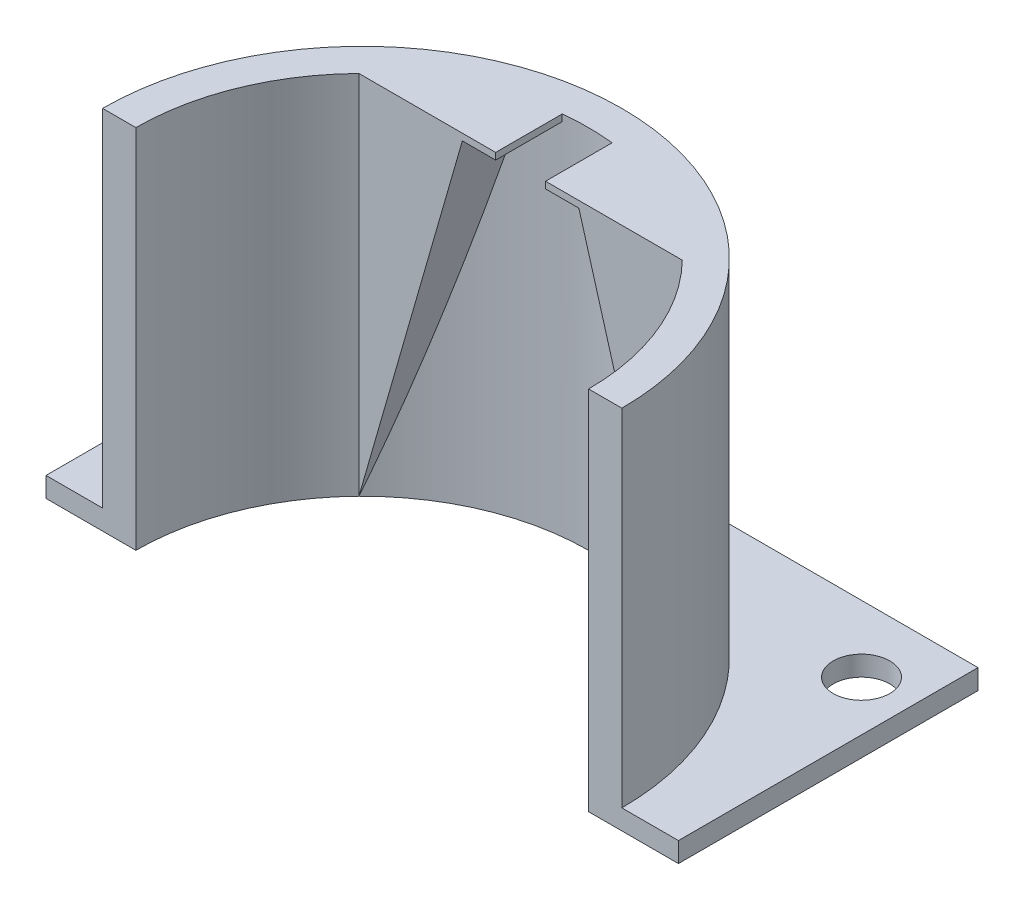
ISO-10303-21;
HEADER;
FILE_DESCRIPTION(('STEP AP214'),'2;1');
FILE_NAME('part.step','',(''),(''),'','','');
FILE_SCHEMA(('AUTOMOTIVE_DESIGN { 1 0 10303 214 1 1 1 1 }'));
ENDSEC;
DATA;
#1=APPLICATION_CONTEXT('core data for automotive mechanical design processes');
#2=APPLICATION_PROTOCOL_DEFINITION('international standard','automotive_design',2000,#1);
#3=PRODUCT_CONTEXT('',#1,'mechanical');
#4=PRODUCT('Part','Part','',(#3));
#5=PRODUCT_RELATED_PRODUCT_CATEGORY('part','',(#4));
#6=PRODUCT_DEFINITION_FORMATION('','',#4);
#7=PRODUCT_DEFINITION_CONTEXT('part definition',#1,'design');
#8=PRODUCT_DEFINITION('design','',#6,#7);
#9=PRODUCT_DEFINITION_SHAPE('','',#8);
#10=(LENGTH_UNIT() NAMED_UNIT(*) SI_UNIT(.MILLI.,.METRE.));
#11=(NAMED_UNIT(*) PLANE_ANGLE_UNIT() SI_UNIT($,.RADIAN.));
#12=(NAMED_UNIT(*) SI_UNIT($,.STERADIAN.) SOLID_ANGLE_UNIT());
#13=UNCERTAINTY_MEASURE_WITH_UNIT(LENGTH_MEASURE(1.E-05),#10,'distance_accuracy_value','');
#14=(GEOMETRIC_REPRESENTATION_CONTEXT(3) GLOBAL_UNCERTAINTY_ASSIGNED_CONTEXT((#13)) GLOBAL_UNIT_ASSIGNED_CONTEXT((#10,
#11,#12)) REPRESENTATION_CONTEXT('',''));
#15=CARTESIAN_POINT('',(0.,0.,0.));
#16=DIRECTION('',(0.,0.,1.));
#17=DIRECTION('',(1.,0.,0.));
#18=AXIS2_PLACEMENT_3D('',#15,#16,#17);
#19=CARTESIAN_POINT('',(0.,55.,45.));
#20=DIRECTION('',(0.,-1.,0.));
#21=DIRECTION('',(0.,0.,-1.));
#22=AXIS2_PLACEMENT_3D('',#19,#20,#21);
#23=CYLINDRICAL_SURFACE('',#22,34.);
#24=CARTESIAN_POINT('',(0.,55.,45.));
#25=DIRECTION('',(0.,-1.,0.));
#26=DIRECTION('',(0.,0.,1.));
#27=AXIS2_PLACEMENT_3D('',#24,#25,#26);
#28=CIRCLE('',#27,34.);
#29=CARTESIAN_POINT('',(24.2881414482345,55.,21.2074342495276));
#30=VERTEX_POINT('',#29);
#31=CARTESIAN_POINT('',(34.,55.,45.));
#32=VERTEX_POINT('',#31);
#33=EDGE_CURVE('E67',#30,#32,#28,.T.);
#34=ORIENTED_EDGE('',*,*,#33,.F.);
#35=DIRECTION('',(0.,1.,0.));
#36=VECTOR('',#35,1.);
#37=CARTESIAN_POINT('',(24.2881414482345,0.,21.2074342495276));
#38=LINE('',#37,#36);
#39=CARTESIAN_POINT('',(24.2881414482345,0.,21.2074342495276));
#40=VERTEX_POINT('',#39);
#41=EDGE_CURVE('E330',#40,#30,#38,.T.);
#42=ORIENTED_EDGE('',*,*,#41,.F.);
#43=CARTESIAN_POINT('',(0.,0.,45.));
#44=DIRECTION('',(0.,-1.,0.));
#45=DIRECTION('',(0.,0.,1.));
#46=AXIS2_PLACEMENT_3D('',#43,#44,#45);
#47=CIRCLE('',#46,34.);
#48=CARTESIAN_POINT('',(34.,0.,45.));
#49=VERTEX_POINT('',#48);
#50=EDGE_CURVE('E165',#40,#49,#47,.T.);
#51=ORIENTED_EDGE('',*,*,#50,.T.);
#52=DIRECTION('',(0.,-1.,0.));
#53=VECTOR('',#52,1.);
#54=CARTESIAN_POINT('',(34.,55.,45.));
#55=LINE('',#54,#53);
#56=EDGE_CURVE('E295',#32,#49,#55,.T.);
#57=ORIENTED_EDGE('',*,*,#56,.F.);
#58=EDGE_LOOP('',(#34,#42,#51,#57));
#59=FACE_BOUND('',#58,.T.);
#60=ADVANCED_FACE('F43',(#59),#23,.F.);
#61=CARTESIAN_POINT('',(-24.2881414482345,0.,21.2074342495276));
#62=VERTEX_POINT('',#61);
#63=EDGE_CURVE('E158',#62,#40,#47,.T.);
#64=ORIENTED_EDGE('',*,*,#63,.T.);
#65=CARTESIAN_POINT('',(0.,84.409042263783,45.));
#66=DIRECTION('',(0.961007175111743,0.276523433697306,0.));
#67=DIRECTION('',(0.276523433697306,-0.961007175111743,0.));
#68=AXIS2_PLACEMENT_3D('',#65,#66,#67);
#69=ELLIPSE('',#68,122.955221354649,34.);
#70=CARTESIAN_POINT('',(8.75000000000001,54.,12.1452058292857));
#71=VERTEX_POINT('',#70);
#72=EDGE_CURVE('E183',#40,#71,#69,.T.);
#73=ORIENTED_EDGE('',*,*,#72,.T.);
#74=CARTESIAN_POINT('',(0.,54.,45.));
#75=DIRECTION('',(0.,1.,0.));
#76=DIRECTION('',(0.,0.,1.));
#77=AXIS2_PLACEMENT_3D('',#74,#75,#76);
#78=CIRCLE('',#77,34.);
#79=CARTESIAN_POINT('',(3.75000000000001,54.,11.2074342495276));
#80=VERTEX_POINT('',#79);
#81=EDGE_CURVE('E364',#71,#80,#78,.T.);
#82=ORIENTED_EDGE('',*,*,#81,.T.);
#83=DIRECTION('',(0.,1.,0.));
#84=VECTOR('',#83,1.);
#85=CARTESIAN_POINT('',(3.74999999999999,0.,11.2074342495276));
#86=LINE('',#85,#84);
#87=CARTESIAN_POINT('',(3.74999999999999,55.,11.2074342495276));
#88=VERTEX_POINT('',#87);
#89=EDGE_CURVE('E340',#80,#88,#86,.T.);
#90=ORIENTED_EDGE('',*,*,#89,.T.);
#91=CARTESIAN_POINT('',(-3.75000000000001,55.,11.2074342495276));
#92=VERTEX_POINT('',#91);
#93=EDGE_CURVE('E271',#92,#88,#28,.T.);
#94=ORIENTED_EDGE('',*,*,#93,.F.);
#95=DIRECTION('',(0.,1.,0.));
#96=VECTOR('',#95,1.);
#97=CARTESIAN_POINT('',(-3.75000000000001,0.,11.2074342495276));
#98=LINE('',#97,#96);
#99=CARTESIAN_POINT('',(-3.75000000000001,54.,11.2074342495276));
#100=VERTEX_POINT('',#99);
#101=EDGE_CURVE('E211',#100,#92,#98,.T.);
#102=ORIENTED_EDGE('',*,*,#101,.F.);
#103=CARTESIAN_POINT('',(0.,54.,45.));
#104=DIRECTION('',(0.,1.,0.));
#105=DIRECTION('',(0.,0.,1.));
#106=AXIS2_PLACEMENT_3D('',#103,#104,#105);
#107=CIRCLE('',#106,34.);
#108=CARTESIAN_POINT('',(-8.75000000000001,54.,12.1452058292857));
#109=VERTEX_POINT('',#108);
#110=EDGE_CURVE('E188',#100,#109,#107,.T.);
#111=ORIENTED_EDGE('',*,*,#110,.T.);
#112=CARTESIAN_POINT('',(0.,84.409042263783,45.));
#113=DIRECTION('',(-0.961007175111743,0.276523433697306,0.));
#114=DIRECTION('',(-0.276523433697306,-0.961007175111743,0.));
#115=AXIS2_PLACEMENT_3D('',#112,#113,#114);
#116=ELLIPSE('',#115,122.955221354649,34.);
#117=EDGE_CURVE('E175',#109,#62,#116,.T.);
#118=ORIENTED_EDGE('',*,*,#117,.T.);
#119=EDGE_LOOP('',(#64,#73,#82,#90,#94,#102,#111,#118));
#120=FACE_BOUND('',#119,.T.);
#121=ADVANCED_FACE('F186',(#120),#23,.F.);
#122=CARTESIAN_POINT('',(47.5,55.,45.));
#123=DIRECTION('',(-1.,0.,0.));
#124=DIRECTION('',(0.,0.,1.));
#125=AXIS2_PLACEMENT_3D('',#122,#123,#124);
#126=PLANE('',#125);
#127=DIRECTION('',(0.,-1.,0.));
#128=VECTOR('',#127,1.);
#129=CARTESIAN_POINT('',(47.5,55.,0.));
#130=LINE('',#129,#128);
#131=CARTESIAN_POINT('',(47.5,3.00000000000003,0.));
#132=VERTEX_POINT('',#131);
#133=CARTESIAN_POINT('',(47.5,0.,0.));
#134=VERTEX_POINT('',#133);
#135=EDGE_CURVE('E11',#132,#134,#130,.T.);
#136=ORIENTED_EDGE('',*,*,#135,.F.);
#137=DIRECTION('',(0.,0.,-1.));
#138=VECTOR('',#137,1.);
#139=CARTESIAN_POINT('',(47.5,3.00000000000003,0.));
#140=LINE('',#139,#138);
#141=CARTESIAN_POINT('',(47.5,3.00000000000003,45.));
#142=VERTEX_POINT('',#141);
#143=EDGE_CURVE('E241',#142,#132,#140,.T.);
#144=ORIENTED_EDGE('',*,*,#143,.F.);
#145=DIRECTION('',(0.,-1.,0.));
#146=VECTOR('',#145,1.);
#147=CARTESIAN_POINT('',(47.5,55.,45.));
#148=LINE('',#147,#146);
#149=CARTESIAN_POINT('',(47.5,0.,45.));
#150=VERTEX_POINT('',#149);
#151=EDGE_CURVE('E275',#142,#150,#148,.T.);
#152=ORIENTED_EDGE('',*,*,#151,.T.);
#153=DIRECTION('',(0.,0.,-1.));
#154=VECTOR('',#153,1.);
#155=CARTESIAN_POINT('',(47.5,0.,45.));
#156=LINE('',#155,#154);
#157=EDGE_CURVE('E260',#150,#134,#156,.T.);
#158=ORIENTED_EDGE('',*,*,#157,.T.);
#159=EDGE_LOOP('',(#136,#144,#152,#158));
#160=FACE_BOUND('',#159,.T.);
#161=ADVANCED_FACE('F45',(#160),#126,.F.);
#162=CARTESIAN_POINT('',(-47.5,55.,0.));
#163=DIRECTION('',(0.,0.,1.));
#164=DIRECTION('',(1.,0.,0.));
#165=AXIS2_PLACEMENT_3D('',#162,#163,#164);
#166=PLANE('',#165);
#167=DIRECTION('',(0.,-1.,0.));
#168=VECTOR('',#167,1.);
#169=CARTESIAN_POINT('',(-47.5,55.,0.));
#170=LINE('',#169,#168);
#171=CARTESIAN_POINT('',(-47.5,3.00000000000003,0.));
#172=VERTEX_POINT('',#171);
#173=CARTESIAN_POINT('',(-47.5,0.,0.));
#174=VERTEX_POINT('',#173);
#175=EDGE_CURVE('E52',#172,#174,#170,.T.);
#176=ORIENTED_EDGE('',*,*,#175,.F.);
#177=DIRECTION('',(-1.,0.,0.));
#178=VECTOR('',#177,1.);
#179=CARTESIAN_POINT('',(-47.5,3.00000000000003,0.));
#180=LINE('',#179,#178);
#181=EDGE_CURVE('E244',#132,#172,#180,.T.);
#182=ORIENTED_EDGE('',*,*,#181,.F.);
#183=ORIENTED_EDGE('',*,*,#135,.T.);
#184=DIRECTION('',(-1.,0.,0.));
#185=VECTOR('',#184,1.);
#186=CARTESIAN_POINT('',(-47.5,0.,0.));
#187=LINE('',#186,#185);
#188=EDGE_CURVE('E279',#134,#174,#187,.T.);
#189=ORIENTED_EDGE('',*,*,#188,.T.);
#190=EDGE_LOOP('',(#176,#182,#183,#189));
#191=FACE_BOUND('',#190,.T.);
#192=ADVANCED_FACE('F313',(#191),#166,.F.);
#193=CARTESIAN_POINT('',(-47.5,55.,0.));
#194=DIRECTION('',(1.,0.,0.));
#195=DIRECTION('',(0.,0.,-1.));
#196=AXIS2_PLACEMENT_3D('',#193,#194,#195);
#197=PLANE('',#196);
#198=DIRECTION('',(0.,-1.,0.));
#199=VECTOR('',#198,1.);
#200=CARTESIAN_POINT('',(-47.5,55.,45.));
#201=LINE('',#200,#199);
#202=CARTESIAN_POINT('',(-47.5,3.00000000000003,45.));
#203=VERTEX_POINT('',#202);
#204=CARTESIAN_POINT('',(-47.5,0.,45.));
#205=VERTEX_POINT('',#204);
#206=EDGE_CURVE('E301',#203,#205,#201,.T.);
#207=ORIENTED_EDGE('',*,*,#206,.F.);
#208=DIRECTION('',(0.,0.,1.));
#209=VECTOR('',#208,1.);
#210=CARTESIAN_POINT('',(-47.5,3.00000000000003,45.));
#211=LINE('',#210,#209);
#212=EDGE_CURVE('E247',#172,#203,#211,.T.);
#213=ORIENTED_EDGE('',*,*,#212,.F.);
#214=ORIENTED_EDGE('',*,*,#175,.T.);
#215=DIRECTION('',(0.,0.,1.));
#216=VECTOR('',#215,1.);
#217=CARTESIAN_POINT('',(-47.5,0.,0.));
#218=LINE('',#217,#216);
#219=EDGE_CURVE('E283',#174,#205,#218,.T.);
#220=ORIENTED_EDGE('',*,*,#219,.T.);
#221=EDGE_LOOP('',(#207,#213,#214,#220));
#222=FACE_BOUND('',#221,.T.);
#223=ADVANCED_FACE('F308',(#222),#197,.F.);
#224=CARTESIAN_POINT('',(-47.5,55.,45.));
#225=DIRECTION('',(0.,0.,-1.));
#226=DIRECTION('',(-1.,0.,0.));
#227=AXIS2_PLACEMENT_3D('',#224,#225,#226);
#228=PLANE('',#227);
#229=DIRECTION('',(1.,0.,0.));
#230=VECTOR('',#229,1.);
#231=CARTESIAN_POINT('',(-47.5,55.,45.));
#232=LINE('',#231,#230);
#233=CARTESIAN_POINT('',(-39.,55.,45.));
#234=VERTEX_POINT('',#233);
#235=CARTESIAN_POINT('',(-34.,55.,45.));
#236=VERTEX_POINT('',#235);
#237=EDGE_CURVE('E264',#234,#236,#232,.T.);
#238=ORIENTED_EDGE('',*,*,#237,.F.);
#239=DIRECTION('',(0.,1.,0.));
#240=VECTOR('',#239,1.);
#241=CARTESIAN_POINT('',(-39.,3.00000000000003,45.));
#242=LINE('',#241,#240);
#243=CARTESIAN_POINT('',(-39.,3.00000000000003,45.));
#244=VERTEX_POINT('',#243);
#245=EDGE_CURVE('E257',#244,#234,#242,.T.);
#246=ORIENTED_EDGE('',*,*,#245,.F.);
#247=DIRECTION('',(1.,0.,0.));
#248=VECTOR('',#247,1.);
#249=CARTESIAN_POINT('',(-39.,3.00000000000003,45.));
#250=LINE('',#249,#248);
#251=EDGE_CURVE('E250',#203,#244,#250,.T.);
#252=ORIENTED_EDGE('',*,*,#251,.F.);
#253=ORIENTED_EDGE('',*,*,#206,.T.);
#254=DIRECTION('',(1.,0.,0.));
#255=VECTOR('',#254,1.);
#256=CARTESIAN_POINT('',(-47.5,0.,45.));
#257=LINE('',#256,#255);
#258=CARTESIAN_POINT('',(-34.,0.,45.));
#259=VERTEX_POINT('',#258);
#260=EDGE_CURVE('E287',#205,#259,#257,.T.);
#261=ORIENTED_EDGE('',*,*,#260,.T.);
#262=DIRECTION('',(0.,-1.,0.));
#263=VECTOR('',#262,1.);
#264=CARTESIAN_POINT('',(-34.,55.,45.));
#265=LINE('',#264,#263);
#266=EDGE_CURVE('E198',#236,#259,#265,.T.);
#267=ORIENTED_EDGE('',*,*,#266,.F.);
#268=EDGE_LOOP('',(#238,#246,#252,#253,#261,#267));
#269=FACE_BOUND('',#268,.T.);
#270=ADVANCED_FACE('F318',(#269),#228,.F.);
#271=EDGE_CURVE('E163',#259,#62,#47,.T.);
#272=ORIENTED_EDGE('',*,*,#271,.T.);
#273=DIRECTION('',(0.,1.,0.));
#274=VECTOR('',#273,1.);
#275=CARTESIAN_POINT('',(-24.2881414482345,0.,21.2074342495276));
#276=LINE('',#275,#274);
#277=CARTESIAN_POINT('',(-24.2881414482345,55.,21.2074342495276));
#278=VERTEX_POINT('',#277);
#279=EDGE_CURVE('E195',#62,#278,#276,.T.);
#280=ORIENTED_EDGE('',*,*,#279,.T.);
#281=EDGE_CURVE('E267',#236,#278,#28,.T.);
#282=ORIENTED_EDGE('',*,*,#281,.F.);
#283=ORIENTED_EDGE('',*,*,#266,.T.);
#284=EDGE_LOOP('',(#272,#280,#282,#283));
#285=FACE_BOUND('',#284,.T.);
#286=ADVANCED_FACE('F193',(#285),#23,.F.);
#287=CARTESIAN_POINT('',(34.,55.,45.));
#288=DIRECTION('',(0.,0.,-1.));
#289=DIRECTION('',(-1.,0.,0.));
#290=AXIS2_PLACEMENT_3D('',#287,#288,#289);
#291=PLANE('',#290);
#292=DIRECTION('',(1.,0.,0.));
#293=VECTOR('',#292,1.);
#294=CARTESIAN_POINT('',(47.5,3.00000000000003,45.));
#295=LINE('',#294,#293);
#296=CARTESIAN_POINT('',(39.,3.00000000000003,45.));
#297=VERTEX_POINT('',#296);
#298=EDGE_CURVE('E238',#297,#142,#295,.T.);
#299=ORIENTED_EDGE('',*,*,#298,.F.);
#300=DIRECTION('',(0.,1.,0.));
#301=VECTOR('',#300,1.);
#302=CARTESIAN_POINT('',(39.,3.00000000000003,45.));
#303=LINE('',#302,#301);
#304=CARTESIAN_POINT('',(39.,55.,45.));
#305=VERTEX_POINT('',#304);
#306=EDGE_CURVE('E254',#297,#305,#303,.T.);
#307=ORIENTED_EDGE('',*,*,#306,.T.);
#308=DIRECTION('',(1.,0.,0.));
#309=VECTOR('',#308,1.);
#310=CARTESIAN_POINT('',(34.,55.,45.));
#311=LINE('',#310,#309);
#312=EDGE_CURVE('E270',#32,#305,#311,.T.);
#313=ORIENTED_EDGE('',*,*,#312,.F.);
#314=ORIENTED_EDGE('',*,*,#56,.T.);
#315=DIRECTION('',(1.,0.,0.));
#316=VECTOR('',#315,1.);
#317=CARTESIAN_POINT('',(34.,0.,45.));
#318=LINE('',#317,#316);
#319=EDGE_CURVE('E200',#49,#150,#318,.T.);
#320=ORIENTED_EDGE('',*,*,#319,.T.);
#321=ORIENTED_EDGE('',*,*,#151,.F.);
#322=EDGE_LOOP('',(#299,#307,#313,#314,#320,#321));
#323=FACE_BOUND('',#322,.T.);
#324=ADVANCED_FACE('F328',(#323),#291,.F.);
#325=CARTESIAN_POINT('',(0.,55.,45.));
#326=DIRECTION('',(0.,1.,0.));
#327=DIRECTION('',(0.,0.,1.));
#328=AXIS2_PLACEMENT_3D('',#325,#326,#327);
#329=PLANE('',#328);
#330=CARTESIAN_POINT('',(0.,55.,45.));
#331=DIRECTION('',(0.,-1.,0.));
#332=DIRECTION('',(0.,0.,-1.));
#333=AXIS2_PLACEMENT_3D('',#330,#331,#332);
#334=CIRCLE('',#333,39.);
#335=EDGE_CURVE('E233',#234,#305,#334,.T.);
#336=ORIENTED_EDGE('',*,*,#335,.F.);
#337=ORIENTED_EDGE('',*,*,#237,.T.);
#338=ORIENTED_EDGE('',*,*,#281,.T.);
#339=DIRECTION('',(1.,0.,0.));
#340=VECTOR('',#339,1.);
#341=CARTESIAN_POINT('',(-24.2881414482345,55.,21.2074342495276));
#342=LINE('',#341,#340);
#343=CARTESIAN_POINT('',(-3.75000000000001,55.,21.2074342495276));
#344=VERTEX_POINT('',#343);
#345=EDGE_CURVE('E204',#278,#344,#342,.T.);
#346=ORIENTED_EDGE('',*,*,#345,.T.);
#347=DIRECTION('',(0.,0.,-1.));
#348=VECTOR('',#347,1.);
#349=CARTESIAN_POINT('',(-3.75000000000001,55.,21.2074342495276));
#350=LINE('',#349,#348);
#351=EDGE_CURVE('E207',#344,#92,#350,.T.);
#352=ORIENTED_EDGE('',*,*,#351,.T.);
#353=ORIENTED_EDGE('',*,*,#93,.T.);
#354=DIRECTION('',(0.,0.,1.));
#355=VECTOR('',#354,1.);
#356=CARTESIAN_POINT('',(3.74999999999999,55.,21.2074342495276));
#357=LINE('',#356,#355);
#358=CARTESIAN_POINT('',(3.74999999999999,55.,21.2074342495276));
#359=VERTEX_POINT('',#358);
#360=EDGE_CURVE('E352',#88,#359,#357,.T.);
#361=ORIENTED_EDGE('',*,*,#360,.T.);
#362=DIRECTION('',(1.,0.,0.));
#363=VECTOR('',#362,1.);
#364=CARTESIAN_POINT('',(3.74999999999999,55.,21.2074342495276));
#365=LINE('',#364,#363);
#366=EDGE_CURVE('E344',#359,#30,#365,.T.);
#367=ORIENTED_EDGE('',*,*,#366,.T.);
#368=ORIENTED_EDGE('',*,*,#33,.T.);
#369=ORIENTED_EDGE('',*,*,#312,.T.);
#370=EDGE_LOOP('',(#336,#337,#338,#346,#352,#353,#361,#367,#368,#369));
#371=FACE_BOUND('',#370,.T.);
#372=ADVANCED_FACE('F399',(#371),#329,.T.);
#373=CARTESIAN_POINT('',(0.,0.,45.));
#374=DIRECTION('',(0.,1.,0.));
#375=DIRECTION('',(0.,0.,1.));
#376=AXIS2_PLACEMENT_3D('',#373,#374,#375);
#377=PLANE('',#376);
#378=CARTESIAN_POINT('',(-40.,0.,9.99999999999998));
#379=DIRECTION('',(0.,1.,0.));
#380=DIRECTION('',(0.,0.,1.));
#381=AXIS2_PLACEMENT_3D('',#378,#379,#380);
#382=CIRCLE('',#381,4.25000000000001);
#383=CARTESIAN_POINT('',(-40.,0.,14.25));
#384=VERTEX_POINT('',#383);
#385=EDGE_CURVE('E229',#384,#384,#382,.T.);
#386=ORIENTED_EDGE('',*,*,#385,.T.);
#387=EDGE_LOOP('',(#386));
#388=FACE_BOUND('',#387,.T.);
#389=CARTESIAN_POINT('',(40.,0.,9.99999999999998));
#390=DIRECTION('',(0.,1.,0.));
#391=DIRECTION('',(0.,0.,1.));
#392=AXIS2_PLACEMENT_3D('',#389,#390,#391);
#393=CIRCLE('',#392,4.25000000000001);
#394=CARTESIAN_POINT('',(40.,0.,14.25));
#395=VERTEX_POINT('',#394);
#396=EDGE_CURVE('E221',#395,#395,#393,.T.);
#397=ORIENTED_EDGE('',*,*,#396,.T.);
#398=EDGE_LOOP('',(#397));
#399=FACE_BOUND('',#398,.T.);
#400=ORIENTED_EDGE('',*,*,#63,.F.);
#401=ORIENTED_EDGE('',*,*,#271,.F.);
#402=ORIENTED_EDGE('',*,*,#260,.F.);
#403=ORIENTED_EDGE('',*,*,#219,.F.);
#404=ORIENTED_EDGE('',*,*,#188,.F.);
#405=ORIENTED_EDGE('',*,*,#157,.F.);
#406=ORIENTED_EDGE('',*,*,#319,.F.);
#407=ORIENTED_EDGE('',*,*,#50,.F.);
#408=EDGE_LOOP('',(#400,#401,#402,#403,#404,#405,#406,#407));
#409=FACE_BOUND('',#408,.T.);
#410=ADVANCED_FACE('F160',(#388,#399,#409),#377,.F.);
#411=CARTESIAN_POINT('',(0.,3.00000000000003,45.));
#412=DIRECTION('',(0.,1.,0.));
#413=DIRECTION('',(0.,0.,1.));
#414=AXIS2_PLACEMENT_3D('',#411,#412,#413);
#415=CYLINDRICAL_SURFACE('',#414,39.);
#416=ORIENTED_EDGE('',*,*,#335,.T.);
#417=ORIENTED_EDGE('',*,*,#306,.F.);
#418=CARTESIAN_POINT('',(0.,3.00000000000003,45.));
#419=DIRECTION('',(0.,-1.,0.));
#420=DIRECTION('',(0.,0.,-1.));
#421=AXIS2_PLACEMENT_3D('',#418,#419,#420);
#422=CIRCLE('',#421,39.);
#423=EDGE_CURVE('E234',#244,#297,#422,.T.);
#424=ORIENTED_EDGE('',*,*,#423,.F.);
#425=ORIENTED_EDGE('',*,*,#245,.T.);
#426=EDGE_LOOP('',(#416,#417,#424,#425));
#427=FACE_BOUND('',#426,.T.);
#428=ADVANCED_FACE('F403',(#427),#415,.T.);
#429=CARTESIAN_POINT('',(0.,3.00000000000003,45.));
#430=DIRECTION('',(0.,-1.,0.));
#431=DIRECTION('',(0.,0.,-1.));
#432=AXIS2_PLACEMENT_3D('',#429,#430,#431);
#433=PLANE('',#432);
#434=CARTESIAN_POINT('',(-40.,3.00000000000003,9.99999999999998));
#435=DIRECTION('',(0.,1.,0.));
#436=DIRECTION('',(0.,0.,1.));
#437=AXIS2_PLACEMENT_3D('',#434,#435,#436);
#438=CIRCLE('',#437,4.25000000000001);
#439=CARTESIAN_POINT('',(-40.,3.00000000000003,14.25));
#440=VERTEX_POINT('',#439);
#441=EDGE_CURVE('E217',#440,#440,#438,.T.);
#442=ORIENTED_EDGE('',*,*,#441,.F.);
#443=EDGE_LOOP('',(#442));
#444=FACE_BOUND('',#443,.T.);
#445=CARTESIAN_POINT('',(40.,3.00000000000003,9.99999999999998));
#446=DIRECTION('',(0.,1.,0.));
#447=DIRECTION('',(0.,0.,1.));
#448=AXIS2_PLACEMENT_3D('',#445,#446,#447);
#449=CIRCLE('',#448,4.25000000000001);
#450=CARTESIAN_POINT('',(40.,3.00000000000003,14.25));
#451=VERTEX_POINT('',#450);
#452=EDGE_CURVE('E222',#451,#451,#449,.T.);
#453=ORIENTED_EDGE('',*,*,#452,.F.);
#454=EDGE_LOOP('',(#453));
#455=FACE_BOUND('',#454,.T.);
#456=ORIENTED_EDGE('',*,*,#423,.T.);
#457=ORIENTED_EDGE('',*,*,#298,.T.);
#458=ORIENTED_EDGE('',*,*,#143,.T.);
#459=ORIENTED_EDGE('',*,*,#181,.T.);
#460=ORIENTED_EDGE('',*,*,#212,.T.);
#461=ORIENTED_EDGE('',*,*,#251,.T.);
#462=EDGE_LOOP('',(#456,#457,#458,#459,#460,#461));
#463=FACE_BOUND('',#462,.T.);
#464=ADVANCED_FACE('F322',(#444,#455,#463),#433,.F.);
#465=CARTESIAN_POINT('',(40.,-1.99999999999997,9.99999999999998));
#466=DIRECTION('',(0.,1.,0.));
#467=DIRECTION('',(0.,0.,1.));
#468=AXIS2_PLACEMENT_3D('',#465,#466,#467);
#469=CYLINDRICAL_SURFACE('',#468,4.25000000000001);
#470=ORIENTED_EDGE('',*,*,#452,.T.);
#471=EDGE_LOOP('',(#470));
#472=FACE_BOUND('',#471,.T.);
#473=ORIENTED_EDGE('',*,*,#396,.F.);
#474=EDGE_LOOP('',(#473));
#475=FACE_BOUND('',#474,.T.);
#476=ADVANCED_FACE('F410',(#472,#475),#469,.F.);
#477=CARTESIAN_POINT('',(-40.,-1.99999999999997,9.99999999999998));
#478=DIRECTION('',(0.,1.,0.));
#479=DIRECTION('',(0.,0.,1.));
#480=AXIS2_PLACEMENT_3D('',#477,#478,#479);
#481=CYLINDRICAL_SURFACE('',#480,4.25000000000001);
#482=ORIENTED_EDGE('',*,*,#441,.T.);
#483=EDGE_LOOP('',(#482));
#484=FACE_BOUND('',#483,.T.);
#485=ORIENTED_EDGE('',*,*,#385,.F.);
#486=EDGE_LOOP('',(#485));
#487=FACE_BOUND('',#486,.T.);
#488=ADVANCED_FACE('F521',(#484,#487),#481,.F.);
#489=CARTESIAN_POINT('',(-3.75000000000001,0.,21.2074342495276));
#490=DIRECTION('',(1.,0.,0.));
#491=DIRECTION('',(0.,0.,-1.));
#492=AXIS2_PLACEMENT_3D('',#489,#490,#491);
#493=PLANE('',#492);
#494=DIRECTION('',(0.,0.,1.));
#495=VECTOR('',#494,1.);
#496=CARTESIAN_POINT('',(-3.75000000000001,54.,-0.00100000000001835));
#497=LINE('',#496,#495);
#498=CARTESIAN_POINT('',(-3.75000000000001,54.,21.2074342495276));
#499=VERTEX_POINT('',#498);
#500=EDGE_CURVE('E356',#100,#499,#497,.T.);
#501=ORIENTED_EDGE('',*,*,#500,.F.);
#502=ORIENTED_EDGE('',*,*,#101,.T.);
#503=ORIENTED_EDGE('',*,*,#351,.F.);
#504=DIRECTION('',(0.,1.,0.));
#505=VECTOR('',#504,1.);
#506=CARTESIAN_POINT('',(-3.75000000000001,0.,21.2074342495276));
#507=LINE('',#506,#505);
#508=EDGE_CURVE('E206',#499,#344,#507,.T.);
#509=ORIENTED_EDGE('',*,*,#508,.F.);
#510=EDGE_LOOP('',(#501,#502,#503,#509));
#511=FACE_BOUND('',#510,.T.);
#512=ADVANCED_FACE('F472',(#511),#493,.T.);
#513=CARTESIAN_POINT('',(-24.2881414482345,0.,21.2074342495276));
#514=DIRECTION('',(0.,0.,1.));
#515=DIRECTION('',(1.,0.,0.));
#516=AXIS2_PLACEMENT_3D('',#513,#514,#515);
#517=PLANE('',#516);
#518=DIRECTION('',(-0.276523433697306,-0.961007175111743,0.));
#519=VECTOR('',#518,1.);
#520=CARTESIAN_POINT('',(-8.75000000000001,54.,21.2074342495276));
#521=LINE('',#520,#519);
#522=CARTESIAN_POINT('',(-8.75000000000001,54.,21.2074342495276));
#523=VERTEX_POINT('',#522);
#524=EDGE_CURVE('E173',#523,#62,#521,.T.);
#525=ORIENTED_EDGE('',*,*,#524,.F.);
#526=DIRECTION('',(-1.,0.,0.));
#527=VECTOR('',#526,1.);
#528=CARTESIAN_POINT('',(-3.75000000000001,54.,21.2074342495276));
#529=LINE('',#528,#527);
#530=EDGE_CURVE('E360',#499,#523,#529,.T.);
#531=ORIENTED_EDGE('',*,*,#530,.F.);
#532=ORIENTED_EDGE('',*,*,#508,.T.);
#533=ORIENTED_EDGE('',*,*,#345,.F.);
#534=ORIENTED_EDGE('',*,*,#279,.F.);
#535=EDGE_LOOP('',(#525,#531,#532,#533,#534));
#536=FACE_BOUND('',#535,.T.);
#537=ADVANCED_FACE('F202',(#536),#517,.T.);
#538=CARTESIAN_POINT('',(3.74999999999999,0.,21.2074342495276));
#539=DIRECTION('',(0.,0.,1.));
#540=DIRECTION('',(1.,0.,0.));
#541=AXIS2_PLACEMENT_3D('',#538,#539,#540);
#542=PLANE('',#541);
#543=DIRECTION('',(-0.276523433697306,0.961007175111743,0.));
#544=VECTOR('',#543,1.);
#545=CARTESIAN_POINT('',(8.75000000000001,54.,21.2074342495276));
#546=LINE('',#545,#544);
#547=CARTESIAN_POINT('',(8.75000000000001,54.,21.2074342495276));
#548=VERTEX_POINT('',#547);
#549=EDGE_CURVE('E380',#40,#548,#546,.T.);
#550=ORIENTED_EDGE('',*,*,#549,.F.);
#551=ORIENTED_EDGE('',*,*,#41,.T.);
#552=ORIENTED_EDGE('',*,*,#366,.F.);
#553=DIRECTION('',(0.,1.,0.));
#554=VECTOR('',#553,1.);
#555=CARTESIAN_POINT('',(3.74999999999999,0.,21.2074342495276));
#556=LINE('',#555,#554);
#557=CARTESIAN_POINT('',(3.74999999999999,54.,21.2074342495276));
#558=VERTEX_POINT('',#557);
#559=EDGE_CURVE('E343',#558,#359,#556,.T.);
#560=ORIENTED_EDGE('',*,*,#559,.F.);
#561=DIRECTION('',(-1.,0.,0.));
#562=VECTOR('',#561,1.);
#563=CARTESIAN_POINT('',(3.75000000000001,54.,21.2074342495276));
#564=LINE('',#563,#562);
#565=EDGE_CURVE('E59',#548,#558,#564,.T.);
#566=ORIENTED_EDGE('',*,*,#565,.F.);
#567=EDGE_LOOP('',(#550,#551,#552,#560,#566));
#568=FACE_BOUND('',#567,.T.);
#569=ADVANCED_FACE('F390',(#568),#542,.T.);
#570=CARTESIAN_POINT('',(3.74999999999999,0.,21.2074342495276));
#571=DIRECTION('',(-1.,0.,0.));
#572=DIRECTION('',(0.,0.,1.));
#573=AXIS2_PLACEMENT_3D('',#570,#571,#572);
#574=PLANE('',#573);
#575=DIRECTION('',(0.,0.,1.));
#576=VECTOR('',#575,1.);
#577=CARTESIAN_POINT('',(3.75000000000001,54.,-0.00100000000001835));
#578=LINE('',#577,#576);
#579=EDGE_CURVE('E361',#80,#558,#578,.T.);
#580=ORIENTED_EDGE('',*,*,#579,.T.);
#581=ORIENTED_EDGE('',*,*,#559,.T.);
#582=ORIENTED_EDGE('',*,*,#360,.F.);
#583=ORIENTED_EDGE('',*,*,#89,.F.);
#584=EDGE_LOOP('',(#580,#581,#582,#583));
#585=FACE_BOUND('',#584,.T.);
#586=ADVANCED_FACE('F394',(#585),#574,.T.);
#587=CARTESIAN_POINT('',(3.75000000000001,54.,-0.00100000000001835));
#588=DIRECTION('',(0.,1.,0.));
#589=DIRECTION('',(0.,0.,1.));
#590=AXIS2_PLACEMENT_3D('',#587,#588,#589);
#591=PLANE('',#590);
#592=DIRECTION('',(0.,0.,1.));
#593=VECTOR('',#592,1.);
#594=CARTESIAN_POINT('',(8.75000000000001,54.,-0.00100000000001835));
#595=LINE('',#594,#593);
#596=EDGE_CURVE('E357',#71,#548,#595,.T.);
#597=ORIENTED_EDGE('',*,*,#596,.T.);
#598=ORIENTED_EDGE('',*,*,#565,.T.);
#599=ORIENTED_EDGE('',*,*,#579,.F.);
#600=ORIENTED_EDGE('',*,*,#81,.F.);
#601=EDGE_LOOP('',(#597,#598,#599,#600));
#602=FACE_BOUND('',#601,.T.);
#603=ADVANCED_FACE('F388',(#602),#591,.F.);
#604=CARTESIAN_POINT('',(-3.75000000000001,54.,-0.00100000000001835));
#605=DIRECTION('',(0.,1.,0.));
#606=DIRECTION('',(0.,0.,1.));
#607=AXIS2_PLACEMENT_3D('',#604,#605,#606);
#608=PLANE('',#607);
#609=ORIENTED_EDGE('',*,*,#500,.T.);
#610=ORIENTED_EDGE('',*,*,#530,.T.);
#611=DIRECTION('',(0.,0.,1.));
#612=VECTOR('',#611,1.);
#613=CARTESIAN_POINT('',(-8.75000000000001,54.,-0.00100000000001835));
#614=LINE('',#613,#612);
#615=EDGE_CURVE('E177',#109,#523,#614,.T.);
#616=ORIENTED_EDGE('',*,*,#615,.F.);
#617=ORIENTED_EDGE('',*,*,#110,.F.);
#618=EDGE_LOOP('',(#609,#610,#616,#617));
#619=FACE_BOUND('',#618,.T.);
#620=ADVANCED_FACE('F492',(#619),#608,.F.);
#621=CARTESIAN_POINT('',(-8.75000000000001,54.,-0.00100000000001835));
#622=DIRECTION('',(-0.961007175111743,0.276523433697306,0.));
#623=DIRECTION('',(-0.276523433697306,-0.961007175111743,0.));
#624=AXIS2_PLACEMENT_3D('',#621,#622,#623);
#625=PLANE('',#624);
#626=ORIENTED_EDGE('',*,*,#615,.T.);
#627=ORIENTED_EDGE('',*,*,#524,.T.);
#628=ORIENTED_EDGE('',*,*,#117,.F.);
#629=EDGE_LOOP('',(#626,#627,#628));
#630=FACE_BOUND('',#629,.T.);
#631=ADVANCED_FACE('F174',(#630),#625,.F.);
#632=CARTESIAN_POINT('',(8.75000000000001,54.,-0.00100000000001835));
#633=DIRECTION('',(0.961007175111743,0.276523433697306,0.));
#634=DIRECTION('',(-0.276523433697306,0.961007175111743,0.));
#635=AXIS2_PLACEMENT_3D('',#632,#633,#634);
#636=PLANE('',#635);
#637=ORIENTED_EDGE('',*,*,#549,.T.);
#638=ORIENTED_EDGE('',*,*,#596,.F.);
#639=ORIENTED_EDGE('',*,*,#72,.F.);
#640=EDGE_LOOP('',(#637,#638,#639));
#641=FACE_BOUND('',#640,.T.);
#642=ADVANCED_FACE('F385',(#641),#636,.F.);
#643=CLOSED_SHELL('',(#60,#121,#161,#192,#223,#270,#286,#324,#372,#410,#428,#464,#476,#488,#512,
#537,#569,#586,#603,#620,#631,#642));
#644=MANIFOLD_SOLID_BREP('B2',#643);
#645=ADVANCED_BREP_SHAPE_REPRESENTATION('',(#18,#644),#14);
#646=SHAPE_DEFINITION_REPRESENTATION(#9,#645);
ENDSEC;
END-ISO-10303-21;
